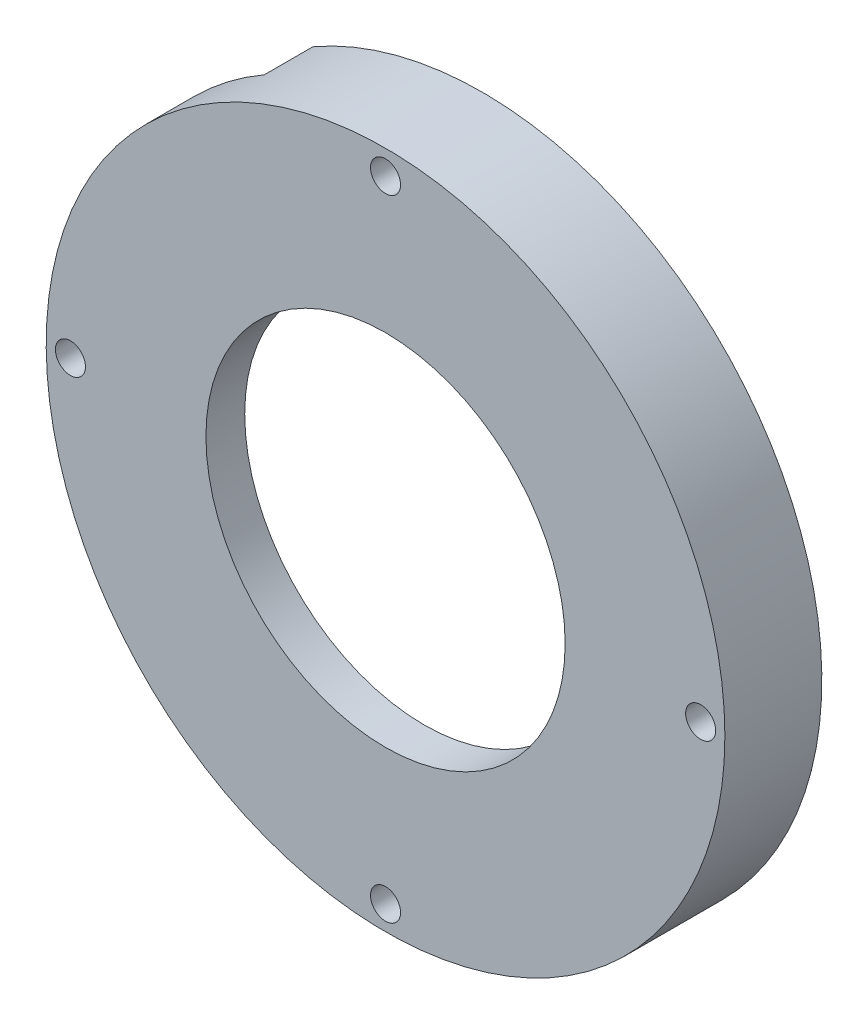
ISO-10303-21;
HEADER;
FILE_DESCRIPTION(('STEP AP214'),'2;1');
FILE_NAME('part.step','',(''),(''),'','','');
FILE_SCHEMA(('AUTOMOTIVE_DESIGN { 1 0 10303 214 1 1 1 1 }'));
ENDSEC;
DATA;
#1=APPLICATION_CONTEXT('core data for automotive mechanical design processes');
#2=APPLICATION_PROTOCOL_DEFINITION('international standard','automotive_design',2000,#1);
#3=PRODUCT_CONTEXT('',#1,'mechanical');
#4=PRODUCT('Part','Part','',(#3));
#5=PRODUCT_RELATED_PRODUCT_CATEGORY('part','',(#4));
#6=PRODUCT_DEFINITION_FORMATION('','',#4);
#7=PRODUCT_DEFINITION_CONTEXT('part definition',#1,'design');
#8=PRODUCT_DEFINITION('design','',#6,#7);
#9=PRODUCT_DEFINITION_SHAPE('','',#8);
#10=(LENGTH_UNIT() NAMED_UNIT(*) SI_UNIT(.MILLI.,.METRE.));
#11=(NAMED_UNIT(*) PLANE_ANGLE_UNIT() SI_UNIT($,.RADIAN.));
#12=(NAMED_UNIT(*) SI_UNIT($,.STERADIAN.) SOLID_ANGLE_UNIT());
#13=UNCERTAINTY_MEASURE_WITH_UNIT(LENGTH_MEASURE(1.E-05),#10,'distance_accuracy_value','');
#14=(GEOMETRIC_REPRESENTATION_CONTEXT(3) GLOBAL_UNCERTAINTY_ASSIGNED_CONTEXT((#13)) GLOBAL_UNIT_ASSIGNED_CONTEXT((#10,
#11,#12)) REPRESENTATION_CONTEXT('',''));
#15=CARTESIAN_POINT('',(0.,0.,0.));
#16=DIRECTION('',(0.,0.,1.));
#17=DIRECTION('',(1.,0.,0.));
#18=AXIS2_PLACEMENT_3D('',#15,#16,#17);
#19=CARTESIAN_POINT('',(0.,0.,10.));
#20=DIRECTION('',(0.,0.,-1.));
#21=DIRECTION('',(-1.,0.,0.));
#22=AXIS2_PLACEMENT_3D('',#19,#20,#21);
#23=CYLINDRICAL_SURFACE('',#22,30.05);
#24=DIRECTION('',(0.,0.,-1.));
#25=VECTOR('',#24,1.);
#26=CARTESIAN_POINT('',(-15.025,26.0240633837224,5.));
#27=LINE('',#26,#25);
#28=CARTESIAN_POINT('',(-15.025,26.0240633837224,5.));
#29=VERTEX_POINT('',#28);
#30=CARTESIAN_POINT('',(-15.025,26.0240633837224,0.));
#31=VERTEX_POINT('',#30);
#32=EDGE_CURVE('E70',#29,#31,#27,.T.);
#33=ORIENTED_EDGE('',*,*,#32,.T.);
#34=CARTESIAN_POINT('',(0.,0.,0.));
#35=DIRECTION('',(0.,0.,1.));
#36=DIRECTION('',(1.,0.,0.));
#37=AXIS2_PLACEMENT_3D('',#34,#35,#36);
#38=CIRCLE('',#37,30.05);
#39=CARTESIAN_POINT('',(-26.0240633837224,15.0249999999999,0.));
#40=VERTEX_POINT('',#39);
#41=EDGE_CURVE('E108',#40,#31,#38,.T.);
#42=ORIENTED_EDGE('',*,*,#41,.F.);
#43=DIRECTION('',(0.,0.,-1.));
#44=VECTOR('',#43,1.);
#45=CARTESIAN_POINT('',(-26.0240633837224,15.0249999999999,5.));
#46=LINE('',#45,#44);
#47=CARTESIAN_POINT('',(-26.0240633837224,15.0249999999999,5.));
#48=VERTEX_POINT('',#47);
#49=EDGE_CURVE('E90',#48,#40,#46,.T.);
#50=ORIENTED_EDGE('',*,*,#49,.F.);
#51=CARTESIAN_POINT('',(0.,0.,5.));
#52=DIRECTION('',(0.,0.,1.));
#53=DIRECTION('',(-1.,0.,0.));
#54=AXIS2_PLACEMENT_3D('',#51,#52,#53);
#55=CIRCLE('',#54,30.05);
#56=EDGE_CURVE('E97',#29,#48,#55,.T.);
#57=ORIENTED_EDGE('',*,*,#56,.F.);
#58=EDGE_LOOP('',(#33,#42,#50,#57));
#59=FACE_BOUND('',#58,.T.);
#60=CARTESIAN_POINT('',(0.,0.,6.));
#61=DIRECTION('',(0.,0.,1.));
#62=DIRECTION('',(1.,0.,0.));
#63=AXIS2_PLACEMENT_3D('',#60,#61,#62);
#64=CIRCLE('',#63,30.05);
#65=CARTESIAN_POINT('',(30.05,0.,6.));
#66=VERTEX_POINT('',#65);
#67=EDGE_CURVE('E122',#66,#66,#64,.T.);
#68=ORIENTED_EDGE('',*,*,#67,.T.);
#69=EDGE_LOOP('',(#68));
#70=FACE_BOUND('',#69,.T.);
#71=ADVANCED_FACE('F45',(#59,#70),#23,.F.);
#72=CARTESIAN_POINT('',(0.,0.,10.));
#73=DIRECTION('',(0.,0.,1.));
#74=DIRECTION('',(1.,0.,0.));
#75=AXIS2_PLACEMENT_3D('',#72,#73,#74);
#76=PLANE('',#75);
#77=CARTESIAN_POINT('',(-32.4999999999991,-9.21715505439516E-13,10.));
#78=DIRECTION('',(0.,0.,1.));
#79=DIRECTION('',(1.,0.,0.));
#80=AXIS2_PLACEMENT_3D('',#77,#78,#79);
#81=CIRCLE('',#80,1.55000000000148);
#82=CARTESIAN_POINT('',(-30.9499999999976,-9.21715505439516E-13,10.));
#83=VERTEX_POINT('',#82);
#84=EDGE_CURVE('E131',#83,#83,#81,.T.);
#85=ORIENTED_EDGE('',*,*,#84,.F.);
#86=EDGE_LOOP('',(#85));
#87=FACE_BOUND('',#86,.T.);
#88=CARTESIAN_POINT('',(1.83547080668457E-12,-32.5,10.));
#89=DIRECTION('',(0.,0.,1.));
#90=DIRECTION('',(1.,0.,0.));
#91=AXIS2_PLACEMENT_3D('',#88,#89,#90);
#92=CIRCLE('',#91,1.55000000000197);
#93=CARTESIAN_POINT('',(1.55000000000381,-32.5,10.));
#94=VERTEX_POINT('',#93);
#95=EDGE_CURVE('E139',#94,#94,#92,.T.);
#96=ORIENTED_EDGE('',*,*,#95,.F.);
#97=EDGE_LOOP('',(#96));
#98=FACE_BOUND('',#97,.T.);
#99=CARTESIAN_POINT('',(32.5000000000009,9.17735403342287E-13,10.));
#100=DIRECTION('',(0.,0.,1.));
#101=DIRECTION('',(1.,0.,0.));
#102=AXIS2_PLACEMENT_3D('',#99,#100,#101);
#103=CIRCLE('',#102,1.55000000000072);
#104=CARTESIAN_POINT('',(34.0500000000016,9.17735403342287E-13,10.));
#105=VERTEX_POINT('',#104);
#106=EDGE_CURVE('E147',#105,#105,#103,.T.);
#107=ORIENTED_EDGE('',*,*,#106,.F.);
#108=EDGE_LOOP('',(#107));
#109=FACE_BOUND('',#108,.T.);
#110=CARTESIAN_POINT('',(0.,32.5,10.));
#111=DIRECTION('',(0.,0.,1.));
#112=DIRECTION('',(1.,0.,0.));
#113=AXIS2_PLACEMENT_3D('',#110,#111,#112);
#114=CIRCLE('',#113,1.55);
#115=CARTESIAN_POINT('',(1.55,32.5,10.));
#116=VERTEX_POINT('',#115);
#117=EDGE_CURVE('E155',#116,#116,#114,.T.);
#118=ORIENTED_EDGE('',*,*,#117,.F.);
#119=EDGE_LOOP('',(#118));
#120=FACE_BOUND('',#119,.T.);
#121=CARTESIAN_POINT('',(0.,0.,10.));
#122=DIRECTION('',(0.,0.,1.));
#123=DIRECTION('',(1.,0.,0.));
#124=AXIS2_PLACEMENT_3D('',#121,#122,#123);
#125=CIRCLE('',#124,35.);
#126=CARTESIAN_POINT('',(35.,0.,10.));
#127=VERTEX_POINT('',#126);
#128=EDGE_CURVE('E12',#127,#127,#125,.T.);
#129=ORIENTED_EDGE('',*,*,#128,.T.);
#130=EDGE_LOOP('',(#129));
#131=FACE_BOUND('',#130,.T.);
#132=CARTESIAN_POINT('',(0.,0.,10.));
#133=DIRECTION('',(0.,0.,1.));
#134=DIRECTION('',(1.,0.,0.));
#135=AXIS2_PLACEMENT_3D('',#132,#133,#134);
#136=CIRCLE('',#135,18.525);
#137=CARTESIAN_POINT('',(18.525,0.,10.));
#138=VERTEX_POINT('',#137);
#139=EDGE_CURVE('E123',#138,#138,#136,.T.);
#140=ORIENTED_EDGE('',*,*,#139,.F.);
#141=EDGE_LOOP('',(#140));
#142=FACE_BOUND('',#141,.T.);
#143=ADVANCED_FACE('F194',(#87,#98,#109,#120,#131,#142),#76,.T.);
#144=CARTESIAN_POINT('',(0.,0.,0.));
#145=DIRECTION('',(0.,0.,1.));
#146=DIRECTION('',(1.,0.,0.));
#147=AXIS2_PLACEMENT_3D('',#144,#145,#146);
#148=PLANE('',#147);
#149=ORIENTED_EDGE('',*,*,#41,.T.);
#150=DIRECTION('',(0.500000000000001,-0.866025403784438,0.));
#151=VECTOR('',#150,1.);
#152=CARTESIAN_POINT('',(-15.025,26.0240633837224,0.));
#153=LINE('',#152,#151);
#154=CARTESIAN_POINT('',(-17.5,30.3108891324553,0.));
#155=VERTEX_POINT('',#154);
#156=EDGE_CURVE('E86',#155,#31,#153,.T.);
#157=ORIENTED_EDGE('',*,*,#156,.F.);
#158=CARTESIAN_POINT('',(0.,0.,0.));
#159=DIRECTION('',(0.,0.,1.));
#160=DIRECTION('',(1.,0.,0.));
#161=AXIS2_PLACEMENT_3D('',#158,#159,#160);
#162=CIRCLE('',#161,35.);
#163=CARTESIAN_POINT('',(-30.3108891324554,17.4999999999999,0.));
#164=VERTEX_POINT('',#163);
#165=EDGE_CURVE('E49',#164,#155,#162,.T.);
#166=ORIENTED_EDGE('',*,*,#165,.F.);
#167=DIRECTION('',(-0.86602540378444,0.499999999999998,0.));
#168=VECTOR('',#167,1.);
#169=CARTESIAN_POINT('',(-26.0240633837224,15.0249999999999,0.));
#170=LINE('',#169,#168);
#171=EDGE_CURVE('E172',#40,#164,#170,.T.);
#172=ORIENTED_EDGE('',*,*,#171,.F.);
#173=EDGE_LOOP('',(#149,#157,#166,#172));
#174=FACE_BOUND('',#173,.T.);
#175=CARTESIAN_POINT('',(0.,32.5,0.));
#176=DIRECTION('',(0.,0.,1.));
#177=DIRECTION('',(1.,0.,0.));
#178=AXIS2_PLACEMENT_3D('',#175,#176,#177);
#179=CIRCLE('',#178,1.55);
#180=CARTESIAN_POINT('',(1.55,32.5,0.));
#181=VERTEX_POINT('',#180);
#182=EDGE_CURVE('E151',#181,#181,#179,.T.);
#183=ORIENTED_EDGE('',*,*,#182,.T.);
#184=EDGE_LOOP('',(#183));
#185=FACE_BOUND('',#184,.T.);
#186=CARTESIAN_POINT('',(32.5000000000009,9.17735403342287E-13,0.));
#187=DIRECTION('',(0.,0.,1.));
#188=DIRECTION('',(1.,0.,0.));
#189=AXIS2_PLACEMENT_3D('',#186,#187,#188);
#190=CIRCLE('',#189,1.55000000000072);
#191=CARTESIAN_POINT('',(34.0500000000016,9.17735403342287E-13,0.));
#192=VERTEX_POINT('',#191);
#193=EDGE_CURVE('E143',#192,#192,#190,.T.);
#194=ORIENTED_EDGE('',*,*,#193,.T.);
#195=EDGE_LOOP('',(#194));
#196=FACE_BOUND('',#195,.T.);
#197=CARTESIAN_POINT('',(1.83547080668457E-12,-32.5,0.));
#198=DIRECTION('',(0.,0.,1.));
#199=DIRECTION('',(1.,0.,0.));
#200=AXIS2_PLACEMENT_3D('',#197,#198,#199);
#201=CIRCLE('',#200,1.55000000000197);
#202=CARTESIAN_POINT('',(1.55000000000381,-32.5,0.));
#203=VERTEX_POINT('',#202);
#204=EDGE_CURVE('E135',#203,#203,#201,.T.);
#205=ORIENTED_EDGE('',*,*,#204,.T.);
#206=EDGE_LOOP('',(#205));
#207=FACE_BOUND('',#206,.T.);
#208=CARTESIAN_POINT('',(-32.4999999999991,-9.21715505439516E-13,0.));
#209=DIRECTION('',(0.,0.,1.));
#210=DIRECTION('',(1.,0.,0.));
#211=AXIS2_PLACEMENT_3D('',#208,#209,#210);
#212=CIRCLE('',#211,1.55000000000148);
#213=CARTESIAN_POINT('',(-30.9499999999976,-9.21715505439516E-13,0.));
#214=VERTEX_POINT('',#213);
#215=EDGE_CURVE('E130',#214,#214,#212,.T.);
#216=ORIENTED_EDGE('',*,*,#215,.T.);
#217=EDGE_LOOP('',(#216));
#218=FACE_BOUND('',#217,.T.);
#219=ADVANCED_FACE('F170',(#174,#185,#196,#207,#218),#148,.F.);
#220=CARTESIAN_POINT('',(0.,0.,10.));
#221=DIRECTION('',(0.,0.,-1.));
#222=DIRECTION('',(-1.,0.,0.));
#223=AXIS2_PLACEMENT_3D('',#220,#221,#222);
#224=CYLINDRICAL_SURFACE('',#223,35.);
#225=ORIENTED_EDGE('',*,*,#165,.T.);
#226=DIRECTION('',(0.,0.,-1.));
#227=VECTOR('',#226,1.);
#228=CARTESIAN_POINT('',(-17.5,30.3108891324553,5.));
#229=LINE('',#228,#227);
#230=CARTESIAN_POINT('',(-17.5,30.3108891324553,5.));
#231=VERTEX_POINT('',#230);
#232=EDGE_CURVE('E113',#231,#155,#229,.T.);
#233=ORIENTED_EDGE('',*,*,#232,.F.);
#234=CARTESIAN_POINT('',(0.,0.,5.));
#235=DIRECTION('',(0.,0.,-1.));
#236=DIRECTION('',(-1.,0.,0.));
#237=AXIS2_PLACEMENT_3D('',#234,#235,#236);
#238=CIRCLE('',#237,35.);
#239=CARTESIAN_POINT('',(-30.3108891324554,17.4999999999999,5.));
#240=VERTEX_POINT('',#239);
#241=EDGE_CURVE('E96',#240,#231,#238,.T.);
#242=ORIENTED_EDGE('',*,*,#241,.F.);
#243=DIRECTION('',(0.,0.,-1.));
#244=VECTOR('',#243,1.);
#245=CARTESIAN_POINT('',(-30.3108891324554,17.4999999999999,5.));
#246=LINE('',#245,#244);
#247=EDGE_CURVE('E93',#240,#164,#246,.T.);
#248=ORIENTED_EDGE('',*,*,#247,.T.);
#249=EDGE_LOOP('',(#225,#233,#242,#248));
#250=FACE_BOUND('',#249,.T.);
#251=ORIENTED_EDGE('',*,*,#128,.F.);
#252=EDGE_LOOP('',(#251));
#253=FACE_BOUND('',#252,.T.);
#254=ADVANCED_FACE('F47',(#250,#253),#224,.T.);
#255=CARTESIAN_POINT('',(0.,32.5,10.));
#256=DIRECTION('',(0.,0.,-1.));
#257=DIRECTION('',(-1.,0.,0.));
#258=AXIS2_PLACEMENT_3D('',#255,#256,#257);
#259=CYLINDRICAL_SURFACE('',#258,1.55);
#260=ORIENTED_EDGE('',*,*,#117,.T.);
#261=EDGE_LOOP('',(#260));
#262=FACE_BOUND('',#261,.T.);
#263=ORIENTED_EDGE('',*,*,#182,.F.);
#264=EDGE_LOOP('',(#263));
#265=FACE_BOUND('',#264,.T.);
#266=ADVANCED_FACE('F202',(#262,#265),#259,.F.);
#267=CARTESIAN_POINT('',(32.5000000000009,9.17735403342287E-13,10.));
#268=DIRECTION('',(0.,0.,-1.));
#269=DIRECTION('',(-1.,0.,0.));
#270=AXIS2_PLACEMENT_3D('',#267,#268,#269);
#271=CYLINDRICAL_SURFACE('',#270,1.55000000000072);
#272=ORIENTED_EDGE('',*,*,#106,.T.);
#273=EDGE_LOOP('',(#272));
#274=FACE_BOUND('',#273,.T.);
#275=ORIENTED_EDGE('',*,*,#193,.F.);
#276=EDGE_LOOP('',(#275));
#277=FACE_BOUND('',#276,.T.);
#278=ADVANCED_FACE('F211',(#274,#277),#271,.F.);
#279=CARTESIAN_POINT('',(1.83547080668457E-12,-32.5,10.));
#280=DIRECTION('',(0.,0.,-1.));
#281=DIRECTION('',(-1.,0.,0.));
#282=AXIS2_PLACEMENT_3D('',#279,#280,#281);
#283=CYLINDRICAL_SURFACE('',#282,1.55000000000197);
#284=ORIENTED_EDGE('',*,*,#95,.T.);
#285=EDGE_LOOP('',(#284));
#286=FACE_BOUND('',#285,.T.);
#287=ORIENTED_EDGE('',*,*,#204,.F.);
#288=EDGE_LOOP('',(#287));
#289=FACE_BOUND('',#288,.T.);
#290=ADVANCED_FACE('F216',(#286,#289),#283,.F.);
#291=CARTESIAN_POINT('',(-32.4999999999991,-9.21715505439516E-13,10.));
#292=DIRECTION('',(0.,0.,-1.));
#293=DIRECTION('',(-1.,0.,0.));
#294=AXIS2_PLACEMENT_3D('',#291,#292,#293);
#295=CYLINDRICAL_SURFACE('',#294,1.55000000000148);
#296=ORIENTED_EDGE('',*,*,#84,.T.);
#297=EDGE_LOOP('',(#296));
#298=FACE_BOUND('',#297,.T.);
#299=ORIENTED_EDGE('',*,*,#215,.F.);
#300=EDGE_LOOP('',(#299));
#301=FACE_BOUND('',#300,.T.);
#302=ADVANCED_FACE('F228',(#298,#301),#295,.F.);
#303=CARTESIAN_POINT('',(0.,0.,6.));
#304=DIRECTION('',(0.,0.,1.));
#305=DIRECTION('',(1.,0.,0.));
#306=AXIS2_PLACEMENT_3D('',#303,#304,#305);
#307=PLANE('',#306);
#308=CARTESIAN_POINT('',(0.,0.,6.));
#309=DIRECTION('',(0.,0.,1.));
#310=DIRECTION('',(1.,0.,0.));
#311=AXIS2_PLACEMENT_3D('',#308,#309,#310);
#312=CIRCLE('',#311,18.525);
#313=CARTESIAN_POINT('',(18.525,0.,6.));
#314=VERTEX_POINT('',#313);
#315=EDGE_CURVE('E118',#314,#314,#312,.T.);
#316=ORIENTED_EDGE('',*,*,#315,.T.);
#317=EDGE_LOOP('',(#316));
#318=FACE_BOUND('',#317,.T.);
#319=ORIENTED_EDGE('',*,*,#67,.F.);
#320=EDGE_LOOP('',(#319));
#321=FACE_BOUND('',#320,.T.);
#322=ADVANCED_FACE('F189',(#318,#321),#307,.F.);
#323=CARTESIAN_POINT('',(0.,0.,6.));
#324=DIRECTION('',(0.,0.,1.));
#325=DIRECTION('',(1.,0.,0.));
#326=AXIS2_PLACEMENT_3D('',#323,#324,#325);
#327=CYLINDRICAL_SURFACE('',#326,18.525);
#328=ORIENTED_EDGE('',*,*,#315,.F.);
#329=EDGE_LOOP('',(#328));
#330=FACE_BOUND('',#329,.T.);
#331=ORIENTED_EDGE('',*,*,#139,.T.);
#332=EDGE_LOOP('',(#331));
#333=FACE_BOUND('',#332,.T.);
#334=ADVANCED_FACE('F182',(#330,#333),#327,.F.);
#335=CARTESIAN_POINT('',(-15.025,26.0240633837224,5.));
#336=DIRECTION('',(0.866025403784438,0.500000000000001,0.));
#337=DIRECTION('',(-0.500000000000001,0.866025403784438,0.));
#338=AXIS2_PLACEMENT_3D('',#335,#336,#337);
#339=PLANE('',#338);
#340=ORIENTED_EDGE('',*,*,#156,.T.);
#341=ORIENTED_EDGE('',*,*,#32,.F.);
#342=DIRECTION('',(0.500000000000001,-0.866025403784438,0.));
#343=VECTOR('',#342,1.);
#344=CARTESIAN_POINT('',(-15.025,26.0240633837224,5.));
#345=LINE('',#344,#343);
#346=EDGE_CURVE('E101',#231,#29,#345,.T.);
#347=ORIENTED_EDGE('',*,*,#346,.F.);
#348=ORIENTED_EDGE('',*,*,#232,.T.);
#349=EDGE_LOOP('',(#340,#341,#347,#348));
#350=FACE_BOUND('',#349,.T.);
#351=ADVANCED_FACE('F180',(#350),#339,.F.);
#352=CARTESIAN_POINT('',(-26.0240633837224,15.0249999999999,5.));
#353=DIRECTION('',(-0.499999999999998,-0.86602540378444,0.));
#354=DIRECTION('',(0.86602540378444,-0.499999999999998,0.));
#355=AXIS2_PLACEMENT_3D('',#352,#353,#354);
#356=PLANE('',#355);
#357=ORIENTED_EDGE('',*,*,#171,.T.);
#358=ORIENTED_EDGE('',*,*,#247,.F.);
#359=DIRECTION('',(-0.86602540378444,0.499999999999998,0.));
#360=VECTOR('',#359,1.);
#361=CARTESIAN_POINT('',(-26.0240633837224,15.0249999999999,5.));
#362=LINE('',#361,#360);
#363=EDGE_CURVE('E61',#48,#240,#362,.T.);
#364=ORIENTED_EDGE('',*,*,#363,.F.);
#365=ORIENTED_EDGE('',*,*,#49,.T.);
#366=EDGE_LOOP('',(#357,#358,#364,#365));
#367=FACE_BOUND('',#366,.T.);
#368=ADVANCED_FACE('F88',(#367),#356,.F.);
#369=CARTESIAN_POINT('',(0.,0.,5.));
#370=DIRECTION('',(0.,0.,-1.));
#371=DIRECTION('',(-1.,0.,0.));
#372=AXIS2_PLACEMENT_3D('',#369,#370,#371);
#373=PLANE('',#372);
#374=ORIENTED_EDGE('',*,*,#56,.T.);
#375=ORIENTED_EDGE('',*,*,#363,.T.);
#376=ORIENTED_EDGE('',*,*,#241,.T.);
#377=ORIENTED_EDGE('',*,*,#346,.T.);
#378=EDGE_LOOP('',(#374,#375,#376,#377));
#379=FACE_BOUND('',#378,.T.);
#380=ADVANCED_FACE('F100',(#379),#373,.T.);
#381=CLOSED_SHELL('',(#71,#143,#219,#254,#266,#278,#290,#302,#322,#334,#351,#368,#380));
#382=MANIFOLD_SOLID_BREP('B2',#381);
#383=ADVANCED_BREP_SHAPE_REPRESENTATION('',(#18,#382),#14);
#384=SHAPE_DEFINITION_REPRESENTATION(#9,#383);
ENDSEC;
END-ISO-10303-21;
